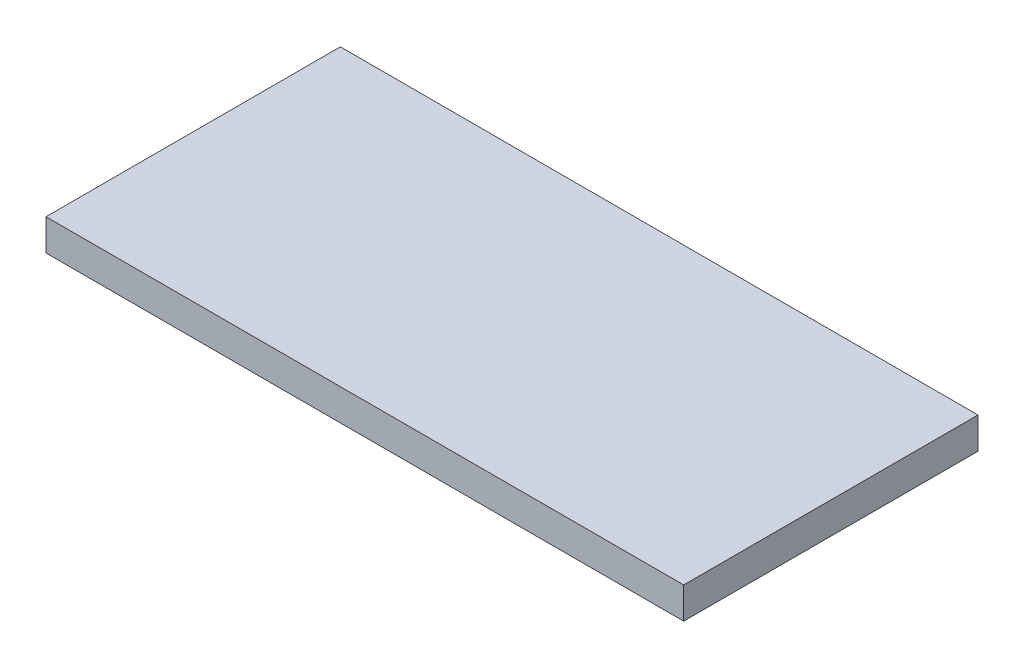
ISO-10303-21;
HEADER;
FILE_DESCRIPTION(('STEP AP214'),'2;1');
FILE_NAME('part.step','',(''),(''),'','','');
FILE_SCHEMA(('AUTOMOTIVE_DESIGN { 1 0 10303 214 1 1 1 1 }'));
ENDSEC;
DATA;
#1=APPLICATION_CONTEXT('core data for automotive mechanical design processes');
#2=APPLICATION_PROTOCOL_DEFINITION('international standard','automotive_design',2000,#1);
#3=PRODUCT_CONTEXT('',#1,'mechanical');
#4=PRODUCT('Part','Part','',(#3));
#5=PRODUCT_RELATED_PRODUCT_CATEGORY('part','',(#4));
#6=PRODUCT_DEFINITION_FORMATION('','',#4);
#7=PRODUCT_DEFINITION_CONTEXT('part definition',#1,'design');
#8=PRODUCT_DEFINITION('design','',#6,#7);
#9=PRODUCT_DEFINITION_SHAPE('','',#8);
#10=(LENGTH_UNIT() NAMED_UNIT(*) SI_UNIT(.MILLI.,.METRE.));
#11=(NAMED_UNIT(*) PLANE_ANGLE_UNIT() SI_UNIT($,.RADIAN.));
#12=(NAMED_UNIT(*) SI_UNIT($,.STERADIAN.) SOLID_ANGLE_UNIT());
#13=UNCERTAINTY_MEASURE_WITH_UNIT(LENGTH_MEASURE(1.E-05),#10,'distance_accuracy_value','');
#14=(GEOMETRIC_REPRESENTATION_CONTEXT(3) GLOBAL_UNCERTAINTY_ASSIGNED_CONTEXT((#13)) GLOBAL_UNIT_ASSIGNED_CONTEXT((#10,
#11,#12)) REPRESENTATION_CONTEXT('',''));
#15=CARTESIAN_POINT('',(0.,0.,0.));
#16=DIRECTION('',(0.,0.,1.));
#17=DIRECTION('',(1.,0.,0.));
#18=AXIS2_PLACEMENT_3D('',#15,#16,#17);
#19=CARTESIAN_POINT('',(0.,3.2,0.));
#20=DIRECTION('',(1.,0.,0.));
#21=DIRECTION('',(0.,0.,-1.));
#22=AXIS2_PLACEMENT_3D('',#19,#20,#21);
#23=PLANE('',#22);
#24=DIRECTION('',(0.,0.,1.));
#25=VECTOR('',#24,1.);
#26=CARTESIAN_POINT('',(0.,0.,0.));
#27=LINE('',#26,#25);
#28=CARTESIAN_POINT('',(0.,0.,-30.));
#29=VERTEX_POINT('',#28);
#30=CARTESIAN_POINT('',(0.,0.,0.));
#31=VERTEX_POINT('',#30);
#32=EDGE_CURVE('E96',#29,#31,#27,.T.);
#33=ORIENTED_EDGE('',*,*,#32,.T.);
#34=DIRECTION('',(0.,-1.,0.));
#35=VECTOR('',#34,1.);
#36=CARTESIAN_POINT('',(0.,3.2,0.));
#37=LINE('',#36,#35);
#38=CARTESIAN_POINT('',(0.,3.2,0.));
#39=VERTEX_POINT('',#38);
#40=EDGE_CURVE('E11',#39,#31,#37,.T.);
#41=ORIENTED_EDGE('',*,*,#40,.F.);
#42=DIRECTION('',(0.,0.,1.));
#43=VECTOR('',#42,1.);
#44=CARTESIAN_POINT('',(0.,3.2,0.));
#45=LINE('',#44,#43);
#46=CARTESIAN_POINT('',(0.,3.2,-30.));
#47=VERTEX_POINT('',#46);
#48=EDGE_CURVE('E84',#47,#39,#45,.T.);
#49=ORIENTED_EDGE('',*,*,#48,.F.);
#50=DIRECTION('',(0.,-1.,0.));
#51=VECTOR('',#50,1.);
#52=CARTESIAN_POINT('',(0.,3.2,-30.));
#53=LINE('',#52,#51);
#54=EDGE_CURVE('E92',#47,#29,#53,.T.);
#55=ORIENTED_EDGE('',*,*,#54,.T.);
#56=EDGE_LOOP('',(#33,#41,#49,#55));
#57=FACE_BOUND('',#56,.T.);
#58=ADVANCED_FACE('F33',(#57),#23,.F.);
#59=CARTESIAN_POINT('',(0.,3.2,0.));
#60=DIRECTION('',(0.,0.,-1.));
#61=DIRECTION('',(-1.,0.,0.));
#62=AXIS2_PLACEMENT_3D('',#59,#60,#61);
#63=PLANE('',#62);
#64=DIRECTION('',(1.,0.,0.));
#65=VECTOR('',#64,1.);
#66=CARTESIAN_POINT('',(0.,0.,0.));
#67=LINE('',#66,#65);
#68=CARTESIAN_POINT('',(65.,0.,0.));
#69=VERTEX_POINT('',#68);
#70=EDGE_CURVE('E88',#31,#69,#67,.T.);
#71=ORIENTED_EDGE('',*,*,#70,.T.);
#72=DIRECTION('',(0.,-1.,0.));
#73=VECTOR('',#72,1.);
#74=CARTESIAN_POINT('',(65.,3.2,0.));
#75=LINE('',#74,#73);
#76=CARTESIAN_POINT('',(65.,3.2,0.));
#77=VERTEX_POINT('',#76);
#78=EDGE_CURVE('E41',#77,#69,#75,.T.);
#79=ORIENTED_EDGE('',*,*,#78,.F.);
#80=DIRECTION('',(1.,0.,0.));
#81=VECTOR('',#80,1.);
#82=CARTESIAN_POINT('',(0.,3.2,0.));
#83=LINE('',#82,#81);
#84=EDGE_CURVE('E79',#39,#77,#83,.T.);
#85=ORIENTED_EDGE('',*,*,#84,.F.);
#86=ORIENTED_EDGE('',*,*,#40,.T.);
#87=EDGE_LOOP('',(#71,#79,#85,#86));
#88=FACE_BOUND('',#87,.T.);
#89=ADVANCED_FACE('F87',(#88),#63,.F.);
#90=CARTESIAN_POINT('',(65.,3.2,0.));
#91=DIRECTION('',(-1.,0.,0.));
#92=DIRECTION('',(0.,0.,1.));
#93=AXIS2_PLACEMENT_3D('',#90,#91,#92);
#94=PLANE('',#93);
#95=DIRECTION('',(0.,0.,-1.));
#96=VECTOR('',#95,1.);
#97=CARTESIAN_POINT('',(65.,0.,0.));
#98=LINE('',#97,#96);
#99=CARTESIAN_POINT('',(65.,0.,-30.));
#100=VERTEX_POINT('',#99);
#101=EDGE_CURVE('E66',#69,#100,#98,.T.);
#102=ORIENTED_EDGE('',*,*,#101,.T.);
#103=DIRECTION('',(0.,-1.,0.));
#104=VECTOR('',#103,1.);
#105=CARTESIAN_POINT('',(65.,3.2,-30.));
#106=LINE('',#105,#104);
#107=CARTESIAN_POINT('',(65.,3.2,-30.));
#108=VERTEX_POINT('',#107);
#109=EDGE_CURVE('E89',#108,#100,#106,.T.);
#110=ORIENTED_EDGE('',*,*,#109,.F.);
#111=DIRECTION('',(0.,0.,-1.));
#112=VECTOR('',#111,1.);
#113=CARTESIAN_POINT('',(65.,3.2,0.));
#114=LINE('',#113,#112);
#115=EDGE_CURVE('E82',#77,#108,#114,.T.);
#116=ORIENTED_EDGE('',*,*,#115,.F.);
#117=ORIENTED_EDGE('',*,*,#78,.T.);
#118=EDGE_LOOP('',(#102,#110,#116,#117));
#119=FACE_BOUND('',#118,.T.);
#120=ADVANCED_FACE('F90',(#119),#94,.F.);
#121=CARTESIAN_POINT('',(0.,3.2,-30.));
#122=DIRECTION('',(0.,0.,1.));
#123=DIRECTION('',(1.,0.,0.));
#124=AXIS2_PLACEMENT_3D('',#121,#122,#123);
#125=PLANE('',#124);
#126=DIRECTION('',(-1.,0.,0.));
#127=VECTOR('',#126,1.);
#128=CARTESIAN_POINT('',(0.,0.,-30.));
#129=LINE('',#128,#127);
#130=EDGE_CURVE('E72',#100,#29,#129,.T.);
#131=ORIENTED_EDGE('',*,*,#130,.T.);
#132=ORIENTED_EDGE('',*,*,#54,.F.);
#133=DIRECTION('',(-1.,0.,0.));
#134=VECTOR('',#133,1.);
#135=CARTESIAN_POINT('',(0.,3.2,-30.));
#136=LINE('',#135,#134);
#137=EDGE_CURVE('E49',#108,#47,#136,.T.);
#138=ORIENTED_EDGE('',*,*,#137,.F.);
#139=ORIENTED_EDGE('',*,*,#109,.T.);
#140=EDGE_LOOP('',(#131,#132,#138,#139));
#141=FACE_BOUND('',#140,.T.);
#142=ADVANCED_FACE('F103',(#141),#125,.F.);
#143=CARTESIAN_POINT('',(0.,3.2,0.));
#144=DIRECTION('',(0.,-1.,0.));
#145=DIRECTION('',(0.,0.,-1.));
#146=AXIS2_PLACEMENT_3D('',#143,#144,#145);
#147=PLANE('',#146);
#148=ORIENTED_EDGE('',*,*,#48,.T.);
#149=ORIENTED_EDGE('',*,*,#84,.T.);
#150=ORIENTED_EDGE('',*,*,#115,.T.);
#151=ORIENTED_EDGE('',*,*,#137,.T.);
#152=EDGE_LOOP('',(#148,#149,#150,#151));
#153=FACE_BOUND('',#152,.T.);
#154=ADVANCED_FACE('F80',(#153),#147,.F.);
#155=CARTESIAN_POINT('',(0.,0.,0.));
#156=DIRECTION('',(0.,-1.,0.));
#157=DIRECTION('',(0.,0.,-1.));
#158=AXIS2_PLACEMENT_3D('',#155,#156,#157);
#159=PLANE('',#158);
#160=ORIENTED_EDGE('',*,*,#32,.F.);
#161=ORIENTED_EDGE('',*,*,#130,.F.);
#162=ORIENTED_EDGE('',*,*,#101,.F.);
#163=ORIENTED_EDGE('',*,*,#70,.F.);
#164=EDGE_LOOP('',(#160,#161,#162,#163));
#165=FACE_BOUND('',#164,.T.);
#166=ADVANCED_FACE('F106',(#165),#159,.T.);
#167=CLOSED_SHELL('',(#58,#89,#120,#142,#154,#166));
#168=MANIFOLD_SOLID_BREP('B2',#167);
#169=ADVANCED_BREP_SHAPE_REPRESENTATION('',(#18,#168),#14);
#170=SHAPE_DEFINITION_REPRESENTATION(#9,#169);
ENDSEC;
END-ISO-10303-21;
